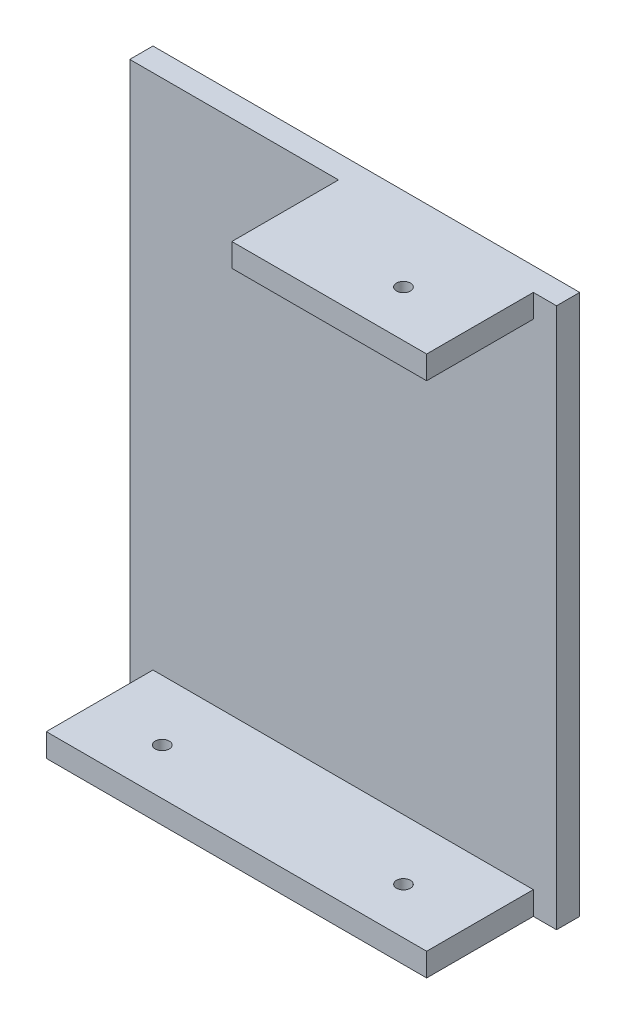
ISO-10303-21;
HEADER;
FILE_DESCRIPTION(('STEP AP214'),'2;1');
FILE_NAME('part.step','',(''),(''),'','','');
FILE_SCHEMA(('AUTOMOTIVE_DESIGN { 1 0 10303 214 1 1 1 1 }'));
ENDSEC;
DATA;
#1=APPLICATION_CONTEXT('core data for automotive mechanical design processes');
#2=APPLICATION_PROTOCOL_DEFINITION('international standard','automotive_design',2000,#1);
#3=PRODUCT_CONTEXT('',#1,'mechanical');
#4=PRODUCT('Part','Part','',(#3));
#5=PRODUCT_RELATED_PRODUCT_CATEGORY('part','',(#4));
#6=PRODUCT_DEFINITION_FORMATION('','',#4);
#7=PRODUCT_DEFINITION_CONTEXT('part definition',#1,'design');
#8=PRODUCT_DEFINITION('design','',#6,#7);
#9=PRODUCT_DEFINITION_SHAPE('','',#8);
#10=(LENGTH_UNIT() NAMED_UNIT(*) SI_UNIT(.MILLI.,.METRE.));
#11=(NAMED_UNIT(*) PLANE_ANGLE_UNIT() SI_UNIT($,.RADIAN.));
#12=(NAMED_UNIT(*) SI_UNIT($,.STERADIAN.) SOLID_ANGLE_UNIT());
#13=UNCERTAINTY_MEASURE_WITH_UNIT(LENGTH_MEASURE(1.E-05),#10,'distance_accuracy_value','');
#14=(GEOMETRIC_REPRESENTATION_CONTEXT(3) GLOBAL_UNCERTAINTY_ASSIGNED_CONTEXT((#13)) GLOBAL_UNIT_ASSIGNED_CONTEXT((#10,
#11,#12)) REPRESENTATION_CONTEXT('',''));
#15=CARTESIAN_POINT('',(0.,0.,0.));
#16=DIRECTION('',(0.,0.,1.));
#17=DIRECTION('',(1.,0.,0.));
#18=AXIS2_PLACEMENT_3D('',#15,#16,#17);
#19=CARTESIAN_POINT('',(0.,0.,5.));
#20=DIRECTION('',(0.,0.,1.));
#21=DIRECTION('',(1.,0.,0.));
#22=AXIS2_PLACEMENT_3D('',#19,#20,#21);
#23=PLANE('',#22);
#24=DIRECTION('',(1.,0.,0.));
#25=VECTOR('',#24,1.);
#26=CARTESIAN_POINT('',(-0.144324934324937,30.3682336182336,5.));
#27=LINE('',#26,#25);
#28=CARTESIAN_POINT('',(-0.144324934324937,30.3682336182336,5.));
#29=VERTEX_POINT('',#28);
#30=CARTESIAN_POINT('',(41.8556750656751,30.3682336182336,5.));
#31=VERTEX_POINT('',#30);
#32=EDGE_CURVE('E49',#29,#31,#27,.T.);
#33=ORIENTED_EDGE('',*,*,#32,.F.);
#34=DIRECTION('',(0.,-1.,0.));
#35=VECTOR('',#34,1.);
#36=CARTESIAN_POINT('',(-0.144324934324945,35.3682336182336,5.));
#37=LINE('',#36,#35);
#38=CARTESIAN_POINT('',(-0.144324934324945,35.3682336182336,5.));
#39=VERTEX_POINT('',#38);
#40=EDGE_CURVE('E143',#39,#29,#37,.T.);
#41=ORIENTED_EDGE('',*,*,#40,.F.);
#42=DIRECTION('',(-1.,0.,0.));
#43=VECTOR('',#42,1.);
#44=CARTESIAN_POINT('',(-45.1443249343249,35.3682336182336,5.));
#45=LINE('',#44,#43);
#46=CARTESIAN_POINT('',(-45.1443249343249,35.3682336182336,5.));
#47=VERTEX_POINT('',#46);
#48=EDGE_CURVE('E277',#39,#47,#45,.T.);
#49=ORIENTED_EDGE('',*,*,#48,.T.);
#50=DIRECTION('',(0.,-1.,0.));
#51=VECTOR('',#50,1.);
#52=CARTESIAN_POINT('',(-45.1443249343249,35.3682336182336,5.));
#53=LINE('',#52,#51);
#54=CARTESIAN_POINT('',(-45.1443249343249,-81.1317663817664,5.));
#55=VERTEX_POINT('',#54);
#56=EDGE_CURVE('E258',#47,#55,#53,.T.);
#57=ORIENTED_EDGE('',*,*,#56,.T.);
#58=DIRECTION('',(1.,0.,0.));
#59=VECTOR('',#58,1.);
#60=CARTESIAN_POINT('',(-45.1443249343249,-81.1317663817664,5.));
#61=LINE('',#60,#59);
#62=CARTESIAN_POINT('',(-40.1443249343249,-81.1317663817664,5.));
#63=VERTEX_POINT('',#62);
#64=EDGE_CURVE('E266',#55,#63,#61,.T.);
#65=ORIENTED_EDGE('',*,*,#64,.T.);
#66=DIRECTION('',(0.,-1.,0.));
#67=VECTOR('',#66,1.);
#68=CARTESIAN_POINT('',(-40.1443249343249,-81.1317663817664,5.));
#69=LINE('',#68,#67);
#70=CARTESIAN_POINT('',(-40.1443249343249,-76.1317663817664,5.));
#71=VERTEX_POINT('',#70);
#72=EDGE_CURVE('E144',#71,#63,#69,.T.);
#73=ORIENTED_EDGE('',*,*,#72,.F.);
#74=DIRECTION('',(-1.,0.,0.));
#75=VECTOR('',#74,1.);
#76=CARTESIAN_POINT('',(-40.1443249343249,-76.1317663817664,5.));
#77=LINE('',#76,#75);
#78=CARTESIAN_POINT('',(41.8556750656751,-76.1317663817664,5.));
#79=VERTEX_POINT('',#78);
#80=EDGE_CURVE('E157',#79,#71,#77,.T.);
#81=ORIENTED_EDGE('',*,*,#80,.F.);
#82=DIRECTION('',(0.,1.,0.));
#83=VECTOR('',#82,1.);
#84=CARTESIAN_POINT('',(41.8556750656751,-81.1317663817664,5.));
#85=LINE('',#84,#83);
#86=CARTESIAN_POINT('',(41.8556750656751,-81.1317663817664,5.));
#87=VERTEX_POINT('',#86);
#88=EDGE_CURVE('E147',#87,#79,#85,.T.);
#89=ORIENTED_EDGE('',*,*,#88,.F.);
#90=CARTESIAN_POINT('',(46.8556750656751,-81.1317663817664,5.));
#91=VERTEX_POINT('',#90);
#92=EDGE_CURVE('E269',#87,#91,#61,.T.);
#93=ORIENTED_EDGE('',*,*,#92,.T.);
#94=DIRECTION('',(0.,1.,0.));
#95=VECTOR('',#94,1.);
#96=CARTESIAN_POINT('',(46.8556750656751,35.3682336182336,5.));
#97=LINE('',#96,#95);
#98=CARTESIAN_POINT('',(46.8556750656751,35.3682336182336,5.));
#99=VERTEX_POINT('',#98);
#100=EDGE_CURVE('E252',#91,#99,#97,.T.);
#101=ORIENTED_EDGE('',*,*,#100,.T.);
#102=CARTESIAN_POINT('',(41.8556750656751,35.3682336182336,5.));
#103=VERTEX_POINT('',#102);
#104=EDGE_CURVE('E196',#99,#103,#45,.T.);
#105=ORIENTED_EDGE('',*,*,#104,.T.);
#106=DIRECTION('',(0.,1.,0.));
#107=VECTOR('',#106,1.);
#108=CARTESIAN_POINT('',(41.8556750656751,35.3682336182336,5.));
#109=LINE('',#108,#107);
#110=EDGE_CURVE('E54',#31,#103,#109,.T.);
#111=ORIENTED_EDGE('',*,*,#110,.F.);
#112=EDGE_LOOP('',(#33,#41,#49,#57,#65,#73,#81,#89,#93,#101,#105,#111));
#113=FACE_BOUND('',#112,.T.);
#114=ADVANCED_FACE('F32',(#113),#23,.T.);
#115=CARTESIAN_POINT('',(-45.1443249343249,35.3682336182336,5.));
#116=DIRECTION('',(1.,0.,0.));
#117=DIRECTION('',(0.,0.,-1.));
#118=AXIS2_PLACEMENT_3D('',#115,#116,#117);
#119=PLANE('',#118);
#120=DIRECTION('',(0.,-1.,0.));
#121=VECTOR('',#120,1.);
#122=CARTESIAN_POINT('',(-45.1443249343249,35.3682336182336,0.));
#123=LINE('',#122,#121);
#124=CARTESIAN_POINT('',(-45.1443249343249,35.3682336182336,0.));
#125=VERTEX_POINT('',#124);
#126=CARTESIAN_POINT('',(-45.1443249343249,-81.1317663817664,0.));
#127=VERTEX_POINT('',#126);
#128=EDGE_CURVE('E249',#125,#127,#123,.T.);
#129=ORIENTED_EDGE('',*,*,#128,.T.);
#130=DIRECTION('',(0.,0.,-1.));
#131=VECTOR('',#130,1.);
#132=CARTESIAN_POINT('',(-45.1443249343249,-81.1317663817664,5.));
#133=LINE('',#132,#131);
#134=EDGE_CURVE('E11',#55,#127,#133,.T.);
#135=ORIENTED_EDGE('',*,*,#134,.F.);
#136=ORIENTED_EDGE('',*,*,#56,.F.);
#137=DIRECTION('',(0.,0.,-1.));
#138=VECTOR('',#137,1.);
#139=CARTESIAN_POINT('',(-45.1443249343249,35.3682336182336,5.));
#140=LINE('',#139,#138);
#141=EDGE_CURVE('E262',#47,#125,#140,.T.);
#142=ORIENTED_EDGE('',*,*,#141,.T.);
#143=EDGE_LOOP('',(#129,#135,#136,#142));
#144=FACE_BOUND('',#143,.T.);
#145=ADVANCED_FACE('F34',(#144),#119,.F.);
#146=CARTESIAN_POINT('',(-45.1443249343249,-81.1317663817664,5.));
#147=DIRECTION('',(0.,1.,0.));
#148=DIRECTION('',(0.,0.,1.));
#149=AXIS2_PLACEMENT_3D('',#146,#147,#148);
#150=PLANE('',#149);
#151=CARTESIAN_POINT('',(26.8556750656751,-81.1317663817664,18.));
#152=DIRECTION('',(0.,-1.,0.));
#153=DIRECTION('',(0.,0.,-1.));
#154=AXIS2_PLACEMENT_3D('',#151,#152,#153);
#155=CIRCLE('',#154,1.5);
#156=CARTESIAN_POINT('',(26.8556750656751,-81.1317663817664,16.5));
#157=VERTEX_POINT('',#156);
#158=EDGE_CURVE('E237',#157,#157,#155,.T.);
#159=ORIENTED_EDGE('',*,*,#158,.F.);
#160=EDGE_LOOP('',(#159));
#161=FACE_BOUND('',#160,.T.);
#162=CARTESIAN_POINT('',(-25.1443249343249,-81.1317663817664,18.));
#163=DIRECTION('',(0.,-1.,0.));
#164=DIRECTION('',(0.,0.,-1.));
#165=AXIS2_PLACEMENT_3D('',#162,#163,#164);
#166=CIRCLE('',#165,1.5);
#167=CARTESIAN_POINT('',(-25.1443249343249,-81.1317663817664,16.5));
#168=VERTEX_POINT('',#167);
#169=EDGE_CURVE('E172',#168,#168,#166,.T.);
#170=ORIENTED_EDGE('',*,*,#169,.F.);
#171=EDGE_LOOP('',(#170));
#172=FACE_BOUND('',#171,.T.);
#173=DIRECTION('',(1.,0.,0.));
#174=VECTOR('',#173,1.);
#175=CARTESIAN_POINT('',(-45.1443249343249,-81.1317663817664,0.));
#176=LINE('',#175,#174);
#177=CARTESIAN_POINT('',(46.8556750656751,-81.1317663817664,0.));
#178=VERTEX_POINT('',#177);
#179=EDGE_CURVE('E240',#127,#178,#176,.T.);
#180=ORIENTED_EDGE('',*,*,#179,.T.);
#181=DIRECTION('',(0.,0.,-1.));
#182=VECTOR('',#181,1.);
#183=CARTESIAN_POINT('',(46.8556750656751,-81.1317663817664,5.));
#184=LINE('',#183,#182);
#185=EDGE_CURVE('E41',#91,#178,#184,.T.);
#186=ORIENTED_EDGE('',*,*,#185,.F.);
#187=ORIENTED_EDGE('',*,*,#92,.F.);
#188=DIRECTION('',(0.,0.,-1.));
#189=VECTOR('',#188,1.);
#190=CARTESIAN_POINT('',(41.8556750656751,-81.1317663817664,28.));
#191=LINE('',#190,#189);
#192=CARTESIAN_POINT('',(41.8556750656751,-81.1317663817664,28.));
#193=VERTEX_POINT('',#192);
#194=EDGE_CURVE('E280',#193,#87,#191,.T.);
#195=ORIENTED_EDGE('',*,*,#194,.F.);
#196=DIRECTION('',(1.,0.,0.));
#197=VECTOR('',#196,1.);
#198=CARTESIAN_POINT('',(-40.1443249343249,-81.1317663817664,28.));
#199=LINE('',#198,#197);
#200=CARTESIAN_POINT('',(-40.1443249343249,-81.1317663817664,28.));
#201=VERTEX_POINT('',#200);
#202=EDGE_CURVE('E156',#201,#193,#199,.T.);
#203=ORIENTED_EDGE('',*,*,#202,.F.);
#204=DIRECTION('',(0.,0.,-1.));
#205=VECTOR('',#204,1.);
#206=CARTESIAN_POINT('',(-40.1443249343249,-81.1317663817664,28.));
#207=LINE('',#206,#205);
#208=EDGE_CURVE('E278',#201,#63,#207,.T.);
#209=ORIENTED_EDGE('',*,*,#208,.T.);
#210=ORIENTED_EDGE('',*,*,#64,.F.);
#211=ORIENTED_EDGE('',*,*,#134,.T.);
#212=EDGE_LOOP('',(#180,#186,#187,#195,#203,#209,#210,#211));
#213=FACE_BOUND('',#212,.T.);
#214=ADVANCED_FACE('F214',(#161,#172,#213),#150,.F.);
#215=CARTESIAN_POINT('',(46.8556750656751,35.3682336182336,5.));
#216=DIRECTION('',(-1.,0.,0.));
#217=DIRECTION('',(0.,-1.,0.));
#218=AXIS2_PLACEMENT_3D('',#215,#216,#217);
#219=PLANE('',#218);
#220=DIRECTION('',(0.,1.,0.));
#221=VECTOR('',#220,1.);
#222=CARTESIAN_POINT('',(46.8556750656751,35.3682336182336,0.));
#223=LINE('',#222,#221);
#224=CARTESIAN_POINT('',(46.8556750656751,35.3682336182336,0.));
#225=VERTEX_POINT('',#224);
#226=EDGE_CURVE('E248',#178,#225,#223,.T.);
#227=ORIENTED_EDGE('',*,*,#226,.T.);
#228=DIRECTION('',(0.,0.,-1.));
#229=VECTOR('',#228,1.);
#230=CARTESIAN_POINT('',(46.8556750656751,35.3682336182336,5.));
#231=LINE('',#230,#229);
#232=EDGE_CURVE('E253',#99,#225,#231,.T.);
#233=ORIENTED_EDGE('',*,*,#232,.F.);
#234=ORIENTED_EDGE('',*,*,#100,.F.);
#235=ORIENTED_EDGE('',*,*,#185,.T.);
#236=EDGE_LOOP('',(#227,#233,#234,#235));
#237=FACE_BOUND('',#236,.T.);
#238=ADVANCED_FACE('F226',(#237),#219,.F.);
#239=CARTESIAN_POINT('',(-45.1443249343249,35.3682336182336,5.));
#240=DIRECTION('',(0.,-1.,0.));
#241=DIRECTION('',(0.,0.,-1.));
#242=AXIS2_PLACEMENT_3D('',#239,#240,#241);
#243=PLANE('',#242);
#244=CARTESIAN_POINT('',(26.8556750656751,35.3682336182336,18.));
#245=DIRECTION('',(0.,-1.,0.));
#246=DIRECTION('',(0.,0.,-1.));
#247=AXIS2_PLACEMENT_3D('',#244,#245,#246);
#248=CIRCLE('',#247,1.5);
#249=CARTESIAN_POINT('',(26.8556750656751,35.3682336182336,16.5));
#250=VERTEX_POINT('',#249);
#251=EDGE_CURVE('E364',#250,#250,#248,.T.);
#252=ORIENTED_EDGE('',*,*,#251,.T.);
#253=EDGE_LOOP('',(#252));
#254=FACE_BOUND('',#253,.T.);
#255=DIRECTION('',(-1.,0.,0.));
#256=VECTOR('',#255,1.);
#257=CARTESIAN_POINT('',(-45.1443249343249,35.3682336182336,0.));
#258=LINE('',#257,#256);
#259=EDGE_CURVE('E256',#225,#125,#258,.T.);
#260=ORIENTED_EDGE('',*,*,#259,.T.);
#261=ORIENTED_EDGE('',*,*,#141,.F.);
#262=ORIENTED_EDGE('',*,*,#48,.F.);
#263=DIRECTION('',(0.,0.,-1.));
#264=VECTOR('',#263,1.);
#265=CARTESIAN_POINT('',(-0.144324934324945,35.3682336182336,28.));
#266=LINE('',#265,#264);
#267=CARTESIAN_POINT('',(-0.144324934324945,35.3682336182336,28.));
#268=VERTEX_POINT('',#267);
#269=EDGE_CURVE('E186',#268,#39,#266,.T.);
#270=ORIENTED_EDGE('',*,*,#269,.F.);
#271=DIRECTION('',(-1.,0.,0.));
#272=VECTOR('',#271,1.);
#273=CARTESIAN_POINT('',(-0.144324934324945,35.3682336182336,28.));
#274=LINE('',#273,#272);
#275=CARTESIAN_POINT('',(41.8556750656751,35.3682336182336,28.));
#276=VERTEX_POINT('',#275);
#277=EDGE_CURVE('E137',#276,#268,#274,.T.);
#278=ORIENTED_EDGE('',*,*,#277,.F.);
#279=DIRECTION('',(0.,0.,-1.));
#280=VECTOR('',#279,1.);
#281=CARTESIAN_POINT('',(41.8556750656751,35.3682336182336,28.));
#282=LINE('',#281,#280);
#283=EDGE_CURVE('E149',#276,#103,#282,.T.);
#284=ORIENTED_EDGE('',*,*,#283,.T.);
#285=ORIENTED_EDGE('',*,*,#104,.F.);
#286=ORIENTED_EDGE('',*,*,#232,.T.);
#287=EDGE_LOOP('',(#260,#261,#262,#270,#278,#284,#285,#286));
#288=FACE_BOUND('',#287,.T.);
#289=ADVANCED_FACE('F194',(#254,#288),#243,.F.);
#290=CARTESIAN_POINT('',(0.,0.,0.));
#291=DIRECTION('',(0.,0.,1.));
#292=DIRECTION('',(1.,0.,0.));
#293=AXIS2_PLACEMENT_3D('',#290,#291,#292);
#294=PLANE('',#293);
#295=ORIENTED_EDGE('',*,*,#128,.F.);
#296=ORIENTED_EDGE('',*,*,#259,.F.);
#297=ORIENTED_EDGE('',*,*,#226,.F.);
#298=ORIENTED_EDGE('',*,*,#179,.F.);
#299=EDGE_LOOP('',(#295,#296,#297,#298));
#300=FACE_BOUND('',#299,.T.);
#301=ADVANCED_FACE('F220',(#300),#294,.F.);
#302=CARTESIAN_POINT('',(-40.1443249343249,-81.1317663817664,28.));
#303=DIRECTION('',(1.,0.,0.));
#304=DIRECTION('',(0.,0.,-1.));
#305=AXIS2_PLACEMENT_3D('',#302,#303,#304);
#306=PLANE('',#305);
#307=ORIENTED_EDGE('',*,*,#72,.T.);
#308=ORIENTED_EDGE('',*,*,#208,.F.);
#309=DIRECTION('',(0.,-1.,0.));
#310=VECTOR('',#309,1.);
#311=CARTESIAN_POINT('',(-40.1443249343249,-81.1317663817664,28.));
#312=LINE('',#311,#310);
#313=CARTESIAN_POINT('',(-40.1443249343249,-76.1317663817664,28.));
#314=VERTEX_POINT('',#313);
#315=EDGE_CURVE('E153',#314,#201,#312,.T.);
#316=ORIENTED_EDGE('',*,*,#315,.F.);
#317=DIRECTION('',(0.,0.,-1.));
#318=VECTOR('',#317,1.);
#319=CARTESIAN_POINT('',(-40.1443249343249,-76.1317663817664,28.));
#320=LINE('',#319,#318);
#321=EDGE_CURVE('E163',#314,#71,#320,.T.);
#322=ORIENTED_EDGE('',*,*,#321,.T.);
#323=EDGE_LOOP('',(#307,#308,#316,#322));
#324=FACE_BOUND('',#323,.T.);
#325=ADVANCED_FACE('F218',(#324),#306,.F.);
#326=CARTESIAN_POINT('',(41.8556750656751,-81.1317663817664,28.));
#327=DIRECTION('',(-1.,0.,0.));
#328=DIRECTION('',(0.,0.,1.));
#329=AXIS2_PLACEMENT_3D('',#326,#327,#328);
#330=PLANE('',#329);
#331=ORIENTED_EDGE('',*,*,#88,.T.);
#332=DIRECTION('',(0.,0.,-1.));
#333=VECTOR('',#332,1.);
#334=CARTESIAN_POINT('',(41.8556750656751,-76.1317663817664,28.));
#335=LINE('',#334,#333);
#336=CARTESIAN_POINT('',(41.8556750656751,-76.1317663817664,28.));
#337=VERTEX_POINT('',#336);
#338=EDGE_CURVE('E283',#337,#79,#335,.T.);
#339=ORIENTED_EDGE('',*,*,#338,.F.);
#340=DIRECTION('',(0.,1.,0.));
#341=VECTOR('',#340,1.);
#342=CARTESIAN_POINT('',(41.8556750656751,-81.1317663817664,28.));
#343=LINE('',#342,#341);
#344=EDGE_CURVE('E159',#193,#337,#343,.T.);
#345=ORIENTED_EDGE('',*,*,#344,.F.);
#346=ORIENTED_EDGE('',*,*,#194,.T.);
#347=EDGE_LOOP('',(#331,#339,#345,#346));
#348=FACE_BOUND('',#347,.T.);
#349=ADVANCED_FACE('F305',(#348),#330,.F.);
#350=CARTESIAN_POINT('',(-40.1443249343249,-76.1317663817664,28.));
#351=DIRECTION('',(0.,-1.,0.));
#352=DIRECTION('',(0.,0.,-1.));
#353=AXIS2_PLACEMENT_3D('',#350,#351,#352);
#354=PLANE('',#353);
#355=CARTESIAN_POINT('',(26.8556750656751,-76.1317663817664,18.));
#356=DIRECTION('',(0.,-1.,0.));
#357=DIRECTION('',(0.,0.,-1.));
#358=AXIS2_PLACEMENT_3D('',#355,#356,#357);
#359=CIRCLE('',#358,1.5);
#360=CARTESIAN_POINT('',(26.8556750656751,-76.1317663817664,16.5));
#361=VERTEX_POINT('',#360);
#362=EDGE_CURVE('E177',#361,#361,#359,.T.);
#363=ORIENTED_EDGE('',*,*,#362,.T.);
#364=EDGE_LOOP('',(#363));
#365=FACE_BOUND('',#364,.T.);
#366=CARTESIAN_POINT('',(-25.1443249343249,-76.1317663817664,18.));
#367=DIRECTION('',(0.,-1.,0.));
#368=DIRECTION('',(0.,0.,-1.));
#369=AXIS2_PLACEMENT_3D('',#366,#367,#368);
#370=CIRCLE('',#369,1.5);
#371=CARTESIAN_POINT('',(-25.1443249343249,-76.1317663817664,16.5));
#372=VERTEX_POINT('',#371);
#373=EDGE_CURVE('E170',#372,#372,#370,.T.);
#374=ORIENTED_EDGE('',*,*,#373,.T.);
#375=EDGE_LOOP('',(#374));
#376=FACE_BOUND('',#375,.T.);
#377=ORIENTED_EDGE('',*,*,#80,.T.);
#378=ORIENTED_EDGE('',*,*,#321,.F.);
#379=DIRECTION('',(-1.,0.,0.));
#380=VECTOR('',#379,1.);
#381=CARTESIAN_POINT('',(-40.1443249343249,-76.1317663817664,28.));
#382=LINE('',#381,#380);
#383=EDGE_CURVE('E161',#337,#314,#382,.T.);
#384=ORIENTED_EDGE('',*,*,#383,.F.);
#385=ORIENTED_EDGE('',*,*,#338,.T.);
#386=EDGE_LOOP('',(#377,#378,#384,#385));
#387=FACE_BOUND('',#386,.T.);
#388=ADVANCED_FACE('F297',(#365,#376,#387),#354,.F.);
#389=CARTESIAN_POINT('',(0.,0.,28.));
#390=DIRECTION('',(0.,0.,-1.));
#391=DIRECTION('',(-1.,0.,0.));
#392=AXIS2_PLACEMENT_3D('',#389,#390,#391);
#393=PLANE('',#392);
#394=ORIENTED_EDGE('',*,*,#315,.T.);
#395=ORIENTED_EDGE('',*,*,#202,.T.);
#396=ORIENTED_EDGE('',*,*,#344,.T.);
#397=ORIENTED_EDGE('',*,*,#383,.T.);
#398=EDGE_LOOP('',(#394,#395,#396,#397));
#399=FACE_BOUND('',#398,.T.);
#400=ADVANCED_FACE('F302',(#399),#393,.F.);
#401=CARTESIAN_POINT('',(-0.144324934324945,35.3682336182336,28.));
#402=DIRECTION('',(1.,0.,0.));
#403=DIRECTION('',(0.,1.,0.));
#404=AXIS2_PLACEMENT_3D('',#401,#402,#403);
#405=PLANE('',#404);
#406=ORIENTED_EDGE('',*,*,#40,.T.);
#407=DIRECTION('',(0.,0.,-1.));
#408=VECTOR('',#407,1.);
#409=CARTESIAN_POINT('',(-0.144324934324937,30.3682336182336,28.));
#410=LINE('',#409,#408);
#411=CARTESIAN_POINT('',(-0.144324934324937,30.3682336182336,28.));
#412=VERTEX_POINT('',#411);
#413=EDGE_CURVE('E125',#412,#29,#410,.T.);
#414=ORIENTED_EDGE('',*,*,#413,.F.);
#415=DIRECTION('',(0.,-1.,0.));
#416=VECTOR('',#415,1.);
#417=CARTESIAN_POINT('',(-0.144324934324945,35.3682336182336,28.));
#418=LINE('',#417,#416);
#419=EDGE_CURVE('E132',#268,#412,#418,.T.);
#420=ORIENTED_EDGE('',*,*,#419,.F.);
#421=ORIENTED_EDGE('',*,*,#269,.T.);
#422=EDGE_LOOP('',(#406,#414,#420,#421));
#423=FACE_BOUND('',#422,.T.);
#424=ADVANCED_FACE('F142',(#423),#405,.F.);
#425=CARTESIAN_POINT('',(-0.144324934324937,30.3682336182336,28.));
#426=DIRECTION('',(0.,1.,0.));
#427=DIRECTION('',(0.,0.,1.));
#428=AXIS2_PLACEMENT_3D('',#425,#426,#427);
#429=PLANE('',#428);
#430=CARTESIAN_POINT('',(26.8556750656751,30.3682336182336,18.));
#431=DIRECTION('',(0.,1.,0.));
#432=DIRECTION('',(0.,0.,1.));
#433=AXIS2_PLACEMENT_3D('',#430,#431,#432);
#434=CIRCLE('',#433,1.5);
#435=CARTESIAN_POINT('',(26.8556750656751,30.3682336182336,19.5));
#436=VERTEX_POINT('',#435);
#437=EDGE_CURVE('E36',#436,#436,#434,.T.);
#438=ORIENTED_EDGE('',*,*,#437,.T.);
#439=EDGE_LOOP('',(#438));
#440=FACE_BOUND('',#439,.T.);
#441=ORIENTED_EDGE('',*,*,#32,.T.);
#442=DIRECTION('',(0.,0.,-1.));
#443=VECTOR('',#442,1.);
#444=CARTESIAN_POINT('',(41.8556750656751,30.3682336182336,28.));
#445=LINE('',#444,#443);
#446=CARTESIAN_POINT('',(41.8556750656751,30.3682336182336,28.));
#447=VERTEX_POINT('',#446);
#448=EDGE_CURVE('E128',#447,#31,#445,.T.);
#449=ORIENTED_EDGE('',*,*,#448,.F.);
#450=DIRECTION('',(1.,0.,0.));
#451=VECTOR('',#450,1.);
#452=CARTESIAN_POINT('',(-0.144324934324937,30.3682336182336,28.));
#453=LINE('',#452,#451);
#454=EDGE_CURVE('E121',#412,#447,#453,.T.);
#455=ORIENTED_EDGE('',*,*,#454,.F.);
#456=ORIENTED_EDGE('',*,*,#413,.T.);
#457=EDGE_LOOP('',(#441,#449,#455,#456));
#458=FACE_BOUND('',#457,.T.);
#459=ADVANCED_FACE('F123',(#440,#458),#429,.F.);
#460=CARTESIAN_POINT('',(41.8556750656751,35.3682336182336,28.));
#461=DIRECTION('',(-1.,0.,0.));
#462=DIRECTION('',(0.,-1.,0.));
#463=AXIS2_PLACEMENT_3D('',#460,#461,#462);
#464=PLANE('',#463);
#465=ORIENTED_EDGE('',*,*,#110,.T.);
#466=ORIENTED_EDGE('',*,*,#283,.F.);
#467=DIRECTION('',(0.,1.,0.));
#468=VECTOR('',#467,1.);
#469=CARTESIAN_POINT('',(41.8556750656751,35.3682336182336,28.));
#470=LINE('',#469,#468);
#471=EDGE_CURVE('E131',#447,#276,#470,.T.);
#472=ORIENTED_EDGE('',*,*,#471,.F.);
#473=ORIENTED_EDGE('',*,*,#448,.T.);
#474=EDGE_LOOP('',(#465,#466,#472,#473));
#475=FACE_BOUND('',#474,.T.);
#476=ADVANCED_FACE('F198',(#475),#464,.F.);
#477=CARTESIAN_POINT('',(0.,0.,28.));
#478=DIRECTION('',(0.,0.,1.));
#479=DIRECTION('',(1.,0.,0.));
#480=AXIS2_PLACEMENT_3D('',#477,#478,#479);
#481=PLANE('',#480);
#482=ORIENTED_EDGE('',*,*,#419,.T.);
#483=ORIENTED_EDGE('',*,*,#454,.T.);
#484=ORIENTED_EDGE('',*,*,#471,.T.);
#485=ORIENTED_EDGE('',*,*,#277,.T.);
#486=EDGE_LOOP('',(#482,#483,#484,#485));
#487=FACE_BOUND('',#486,.T.);
#488=ADVANCED_FACE('F135',(#487),#481,.T.);
#489=CARTESIAN_POINT('',(-25.1443249343249,35.3682336182336,18.));
#490=DIRECTION('',(0.,-1.,0.));
#491=DIRECTION('',(0.,0.,-1.));
#492=AXIS2_PLACEMENT_3D('',#489,#490,#491);
#493=CYLINDRICAL_SURFACE('',#492,1.5);
#494=ORIENTED_EDGE('',*,*,#169,.T.);
#495=EDGE_LOOP('',(#494));
#496=FACE_BOUND('',#495,.T.);
#497=ORIENTED_EDGE('',*,*,#373,.F.);
#498=EDGE_LOOP('',(#497));
#499=FACE_BOUND('',#498,.T.);
#500=ADVANCED_FACE('F205',(#496,#499),#493,.F.);
#501=CARTESIAN_POINT('',(26.8556750656751,35.3682336182336,18.));
#502=DIRECTION('',(0.,-1.,0.));
#503=DIRECTION('',(0.,0.,-1.));
#504=AXIS2_PLACEMENT_3D('',#501,#502,#503);
#505=CYLINDRICAL_SURFACE('',#504,1.5);
#506=ORIENTED_EDGE('',*,*,#251,.F.);
#507=EDGE_LOOP('',(#506));
#508=FACE_BOUND('',#507,.T.);
#509=ORIENTED_EDGE('',*,*,#437,.F.);
#510=EDGE_LOOP('',(#509));
#511=FACE_BOUND('',#510,.T.);
#512=ADVANCED_FACE('F339',(#508,#511),#505,.F.);
#513=ORIENTED_EDGE('',*,*,#158,.T.);
#514=EDGE_LOOP('',(#513));
#515=FACE_BOUND('',#514,.T.);
#516=ORIENTED_EDGE('',*,*,#362,.F.);
#517=EDGE_LOOP('',(#516));
#518=FACE_BOUND('',#517,.T.);
#519=ADVANCED_FACE('F349',(#515,#518),#505,.F.);
#520=CLOSED_SHELL('',(#114,#145,#214,#238,#289,#301,#325,#349,#388,#400,#424,#459,#476,#488,
#500,#512,#519));
#521=MANIFOLD_SOLID_BREP('B2',#520);
#522=ADVANCED_BREP_SHAPE_REPRESENTATION('',(#18,#521),#14);
#523=SHAPE_DEFINITION_REPRESENTATION(#9,#522);
ENDSEC;
END-ISO-10303-21;
